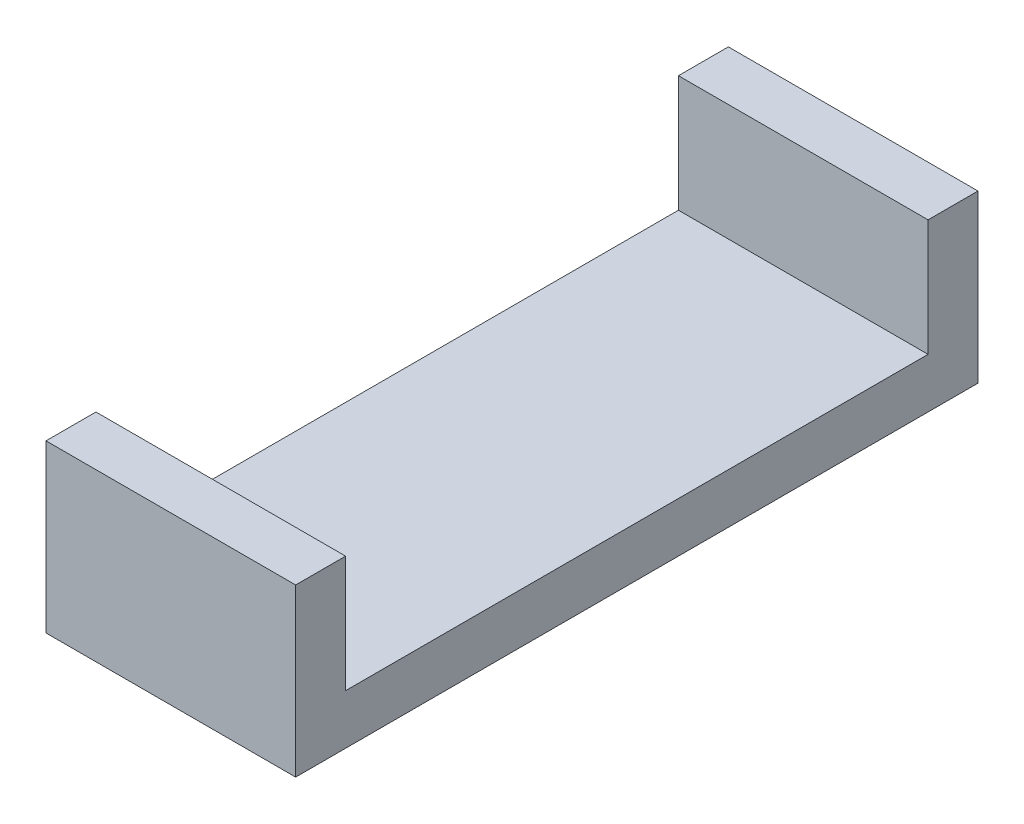
ISO-10303-21;
HEADER;
FILE_DESCRIPTION(('STEP AP214'),'2;1');
FILE_NAME('part.step','',(''),(''),'','','');
FILE_SCHEMA(('AUTOMOTIVE_DESIGN { 1 0 10303 214 1 1 1 1 }'));
ENDSEC;
DATA;
#1=APPLICATION_CONTEXT('core data for automotive mechanical design processes');
#2=APPLICATION_PROTOCOL_DEFINITION('international standard','automotive_design',2000,#1);
#3=PRODUCT_CONTEXT('',#1,'mechanical');
#4=PRODUCT('Part','Part','',(#3));
#5=PRODUCT_RELATED_PRODUCT_CATEGORY('part','',(#4));
#6=PRODUCT_DEFINITION_FORMATION('','',#4);
#7=PRODUCT_DEFINITION_CONTEXT('part definition',#1,'design');
#8=PRODUCT_DEFINITION('design','',#6,#7);
#9=PRODUCT_DEFINITION_SHAPE('','',#8);
#10=(LENGTH_UNIT() NAMED_UNIT(*) SI_UNIT(.MILLI.,.METRE.));
#11=(NAMED_UNIT(*) PLANE_ANGLE_UNIT() SI_UNIT($,.RADIAN.));
#12=(NAMED_UNIT(*) SI_UNIT($,.STERADIAN.) SOLID_ANGLE_UNIT());
#13=UNCERTAINTY_MEASURE_WITH_UNIT(LENGTH_MEASURE(1.E-05),#10,'distance_accuracy_value','');
#14=(GEOMETRIC_REPRESENTATION_CONTEXT(3) GLOBAL_UNCERTAINTY_ASSIGNED_CONTEXT((#13)) GLOBAL_UNIT_ASSIGNED_CONTEXT((#10,
#11,#12)) REPRESENTATION_CONTEXT('',''));
#15=CARTESIAN_POINT('',(0.,0.,0.));
#16=DIRECTION('',(0.,0.,1.));
#17=DIRECTION('',(1.,0.,0.));
#18=AXIS2_PLACEMENT_3D('',#15,#16,#17);
#19=CARTESIAN_POINT('',(0.,3.,0.));
#20=DIRECTION('',(0.,1.,0.));
#21=DIRECTION('',(0.,0.,1.));
#22=AXIS2_PLACEMENT_3D('',#19,#20,#21);
#23=PLANE('',#22);
#24=DIRECTION('',(0.,0.,-1.));
#25=VECTOR('',#24,1.);
#26=CARTESIAN_POINT('',(7.49999999999999,3.,-20.5));
#27=LINE('',#26,#25);
#28=CARTESIAN_POINT('',(7.5,3.,17.5));
#29=VERTEX_POINT('',#28);
#30=CARTESIAN_POINT('',(7.49999999999999,3.,-17.5));
#31=VERTEX_POINT('',#30);
#32=EDGE_CURVE('E53',#29,#31,#27,.T.);
#33=ORIENTED_EDGE('',*,*,#32,.T.);
#34=DIRECTION('',(1.,0.,0.));
#35=VECTOR('',#34,1.);
#36=CARTESIAN_POINT('',(7.5,3.,-17.5));
#37=LINE('',#36,#35);
#38=CARTESIAN_POINT('',(-7.5,3.,-17.5));
#39=VERTEX_POINT('',#38);
#40=EDGE_CURVE('E48',#39,#31,#37,.T.);
#41=ORIENTED_EDGE('',*,*,#40,.F.);
#42=DIRECTION('',(0.,0.,1.));
#43=VECTOR('',#42,1.);
#44=CARTESIAN_POINT('',(-7.5,3.,-20.5));
#45=LINE('',#44,#43);
#46=CARTESIAN_POINT('',(-7.5,3.,17.5));
#47=VERTEX_POINT('',#46);
#48=EDGE_CURVE('E119',#39,#47,#45,.T.);
#49=ORIENTED_EDGE('',*,*,#48,.T.);
#50=DIRECTION('',(-1.,0.,0.));
#51=VECTOR('',#50,1.);
#52=CARTESIAN_POINT('',(7.5,3.,17.5));
#53=LINE('',#52,#51);
#54=EDGE_CURVE('E120',#29,#47,#53,.T.);
#55=ORIENTED_EDGE('',*,*,#54,.F.);
#56=EDGE_LOOP('',(#33,#41,#49,#55));
#57=FACE_BOUND('',#56,.T.);
#58=ADVANCED_FACE('F33',(#57),#23,.T.);
#59=CARTESIAN_POINT('',(7.49999999999999,3.,-20.5));
#60=DIRECTION('',(-1.,0.,0.));
#61=DIRECTION('',(0.,0.,1.));
#62=AXIS2_PLACEMENT_3D('',#59,#60,#61);
#63=PLANE('',#62);
#64=DIRECTION('',(0.,0.,-1.));
#65=VECTOR('',#64,1.);
#66=CARTESIAN_POINT('',(7.49999999999999,0.,-20.5));
#67=LINE('',#66,#65);
#68=CARTESIAN_POINT('',(7.5,0.,20.5));
#69=VERTEX_POINT('',#68);
#70=CARTESIAN_POINT('',(7.49999999999999,0.,-20.5));
#71=VERTEX_POINT('',#70);
#72=EDGE_CURVE('E142',#69,#71,#67,.T.);
#73=ORIENTED_EDGE('',*,*,#72,.T.);
#74=DIRECTION('',(0.,-1.,0.));
#75=VECTOR('',#74,1.);
#76=CARTESIAN_POINT('',(7.49999999999999,3.,-20.5));
#77=LINE('',#76,#75);
#78=CARTESIAN_POINT('',(7.49999999999999,10.,-20.5));
#79=VERTEX_POINT('',#78);
#80=EDGE_CURVE('E11',#79,#71,#77,.T.);
#81=ORIENTED_EDGE('',*,*,#80,.F.);
#82=DIRECTION('',(0.,0.,-1.));
#83=VECTOR('',#82,1.);
#84=CARTESIAN_POINT('',(7.49999999999999,10.,-20.5));
#85=LINE('',#84,#83);
#86=CARTESIAN_POINT('',(7.5,10.,-17.5));
#87=VERTEX_POINT('',#86);
#88=EDGE_CURVE('E106',#87,#79,#85,.T.);
#89=ORIENTED_EDGE('',*,*,#88,.F.);
#90=DIRECTION('',(0.,-1.,0.));
#91=VECTOR('',#90,1.);
#92=CARTESIAN_POINT('',(7.5,10.,-17.5));
#93=LINE('',#92,#91);
#94=EDGE_CURVE('E102',#87,#31,#93,.T.);
#95=ORIENTED_EDGE('',*,*,#94,.T.);
#96=ORIENTED_EDGE('',*,*,#32,.F.);
#97=DIRECTION('',(0.,-1.,0.));
#98=VECTOR('',#97,1.);
#99=CARTESIAN_POINT('',(7.5,10.,17.5));
#100=LINE('',#99,#98);
#101=CARTESIAN_POINT('',(7.5,10.,17.5));
#102=VERTEX_POINT('',#101);
#103=EDGE_CURVE('E139',#102,#29,#100,.T.);
#104=ORIENTED_EDGE('',*,*,#103,.F.);
#105=DIRECTION('',(0.,0.,-1.));
#106=VECTOR('',#105,1.);
#107=CARTESIAN_POINT('',(7.5,10.,20.5));
#108=LINE('',#107,#106);
#109=CARTESIAN_POINT('',(7.5,10.,20.5));
#110=VERTEX_POINT('',#109);
#111=EDGE_CURVE('E130',#110,#102,#108,.T.);
#112=ORIENTED_EDGE('',*,*,#111,.F.);
#113=DIRECTION('',(0.,-1.,0.));
#114=VECTOR('',#113,1.);
#115=CARTESIAN_POINT('',(7.5,3.,20.5));
#116=LINE('',#115,#114);
#117=EDGE_CURVE('E146',#110,#69,#116,.T.);
#118=ORIENTED_EDGE('',*,*,#117,.T.);
#119=EDGE_LOOP('',(#73,#81,#89,#95,#96,#104,#112,#118));
#120=FACE_BOUND('',#119,.T.);
#121=ADVANCED_FACE('F35',(#120),#63,.F.);
#122=CARTESIAN_POINT('',(-7.5,3.,-20.5));
#123=DIRECTION('',(0.,0.,1.));
#124=DIRECTION('',(1.,0.,0.));
#125=AXIS2_PLACEMENT_3D('',#122,#123,#124);
#126=PLANE('',#125);
#127=DIRECTION('',(-1.,0.,0.));
#128=VECTOR('',#127,1.);
#129=CARTESIAN_POINT('',(-7.5,0.,-20.5));
#130=LINE('',#129,#128);
#131=CARTESIAN_POINT('',(-7.5,0.,-20.5));
#132=VERTEX_POINT('',#131);
#133=EDGE_CURVE('E149',#71,#132,#130,.T.);
#134=ORIENTED_EDGE('',*,*,#133,.T.);
#135=DIRECTION('',(0.,-1.,0.));
#136=VECTOR('',#135,1.);
#137=CARTESIAN_POINT('',(-7.5,3.,-20.5));
#138=LINE('',#137,#136);
#139=CARTESIAN_POINT('',(-7.5,10.,-20.5));
#140=VERTEX_POINT('',#139);
#141=EDGE_CURVE('E41',#140,#132,#138,.T.);
#142=ORIENTED_EDGE('',*,*,#141,.F.);
#143=DIRECTION('',(-1.,0.,0.));
#144=VECTOR('',#143,1.);
#145=CARTESIAN_POINT('',(-7.5,10.,-20.5));
#146=LINE('',#145,#144);
#147=EDGE_CURVE('E113',#79,#140,#146,.T.);
#148=ORIENTED_EDGE('',*,*,#147,.F.);
#149=ORIENTED_EDGE('',*,*,#80,.T.);
#150=EDGE_LOOP('',(#134,#142,#148,#149));
#151=FACE_BOUND('',#150,.T.);
#152=ADVANCED_FACE('F179',(#151),#126,.F.);
#153=CARTESIAN_POINT('',(-7.5,3.,-20.5));
#154=DIRECTION('',(1.,0.,0.));
#155=DIRECTION('',(0.,0.,-1.));
#156=AXIS2_PLACEMENT_3D('',#153,#154,#155);
#157=PLANE('',#156);
#158=DIRECTION('',(0.,0.,1.));
#159=VECTOR('',#158,1.);
#160=CARTESIAN_POINT('',(-7.5,0.,-20.5));
#161=LINE('',#160,#159);
#162=CARTESIAN_POINT('',(-7.49999999999999,0.,20.5));
#163=VERTEX_POINT('',#162);
#164=EDGE_CURVE('E151',#132,#163,#161,.T.);
#165=ORIENTED_EDGE('',*,*,#164,.T.);
#166=DIRECTION('',(0.,-1.,0.));
#167=VECTOR('',#166,1.);
#168=CARTESIAN_POINT('',(-7.49999999999999,3.,20.5));
#169=LINE('',#168,#167);
#170=CARTESIAN_POINT('',(-7.49999999999999,10.,20.5));
#171=VERTEX_POINT('',#170);
#172=EDGE_CURVE('E156',#171,#163,#169,.T.);
#173=ORIENTED_EDGE('',*,*,#172,.F.);
#174=DIRECTION('',(0.,0.,1.));
#175=VECTOR('',#174,1.);
#176=CARTESIAN_POINT('',(-7.5,10.,17.5));
#177=LINE('',#176,#175);
#178=CARTESIAN_POINT('',(-7.5,10.,17.5));
#179=VERTEX_POINT('',#178);
#180=EDGE_CURVE('E134',#179,#171,#177,.T.);
#181=ORIENTED_EDGE('',*,*,#180,.F.);
#182=DIRECTION('',(0.,-1.,0.));
#183=VECTOR('',#182,1.);
#184=CARTESIAN_POINT('',(-7.5,10.,17.5));
#185=LINE('',#184,#183);
#186=EDGE_CURVE('E136',#179,#47,#185,.T.);
#187=ORIENTED_EDGE('',*,*,#186,.T.);
#188=ORIENTED_EDGE('',*,*,#48,.F.);
#189=DIRECTION('',(0.,-1.,0.));
#190=VECTOR('',#189,1.);
#191=CARTESIAN_POINT('',(-7.5,10.,-17.5));
#192=LINE('',#191,#190);
#193=CARTESIAN_POINT('',(-7.5,10.,-17.5));
#194=VERTEX_POINT('',#193);
#195=EDGE_CURVE('E100',#194,#39,#192,.T.);
#196=ORIENTED_EDGE('',*,*,#195,.F.);
#197=DIRECTION('',(0.,0.,1.));
#198=VECTOR('',#197,1.);
#199=CARTESIAN_POINT('',(-7.5,10.,-17.5));
#200=LINE('',#199,#198);
#201=EDGE_CURVE('E107',#140,#194,#200,.T.);
#202=ORIENTED_EDGE('',*,*,#201,.F.);
#203=ORIENTED_EDGE('',*,*,#141,.T.);
#204=EDGE_LOOP('',(#165,#173,#181,#187,#188,#196,#202,#203));
#205=FACE_BOUND('',#204,.T.);
#206=ADVANCED_FACE('F117',(#205),#157,.F.);
#207=CARTESIAN_POINT('',(-7.49999999999999,3.,20.5));
#208=DIRECTION('',(0.,0.,-1.));
#209=DIRECTION('',(-1.,0.,0.));
#210=AXIS2_PLACEMENT_3D('',#207,#208,#209);
#211=PLANE('',#210);
#212=DIRECTION('',(1.,0.,0.));
#213=VECTOR('',#212,1.);
#214=CARTESIAN_POINT('',(-7.49999999999999,0.,20.5));
#215=LINE('',#214,#213);
#216=EDGE_CURVE('E144',#163,#69,#215,.T.);
#217=ORIENTED_EDGE('',*,*,#216,.T.);
#218=ORIENTED_EDGE('',*,*,#117,.F.);
#219=DIRECTION('',(1.,0.,0.));
#220=VECTOR('',#219,1.);
#221=CARTESIAN_POINT('',(-7.49999999999999,10.,20.5));
#222=LINE('',#221,#220);
#223=EDGE_CURVE('E123',#171,#110,#222,.T.);
#224=ORIENTED_EDGE('',*,*,#223,.F.);
#225=ORIENTED_EDGE('',*,*,#172,.T.);
#226=EDGE_LOOP('',(#217,#218,#224,#225));
#227=FACE_BOUND('',#226,.T.);
#228=ADVANCED_FACE('F165',(#227),#211,.F.);
#229=CARTESIAN_POINT('',(0.,0.,0.));
#230=DIRECTION('',(0.,1.,0.));
#231=DIRECTION('',(0.,0.,1.));
#232=AXIS2_PLACEMENT_3D('',#229,#230,#231);
#233=PLANE('',#232);
#234=ORIENTED_EDGE('',*,*,#72,.F.);
#235=ORIENTED_EDGE('',*,*,#216,.F.);
#236=ORIENTED_EDGE('',*,*,#164,.F.);
#237=ORIENTED_EDGE('',*,*,#133,.F.);
#238=EDGE_LOOP('',(#234,#235,#236,#237));
#239=FACE_BOUND('',#238,.T.);
#240=ADVANCED_FACE('F163',(#239),#233,.F.);
#241=CARTESIAN_POINT('',(7.5,10.,17.5));
#242=DIRECTION('',(0.,0.,1.));
#243=DIRECTION('',(1.,0.,0.));
#244=AXIS2_PLACEMENT_3D('',#241,#242,#243);
#245=PLANE('',#244);
#246=ORIENTED_EDGE('',*,*,#54,.T.);
#247=ORIENTED_EDGE('',*,*,#186,.F.);
#248=DIRECTION('',(-1.,0.,0.));
#249=VECTOR('',#248,1.);
#250=CARTESIAN_POINT('',(7.5,10.,17.5));
#251=LINE('',#250,#249);
#252=EDGE_CURVE('E132',#102,#179,#251,.T.);
#253=ORIENTED_EDGE('',*,*,#252,.F.);
#254=ORIENTED_EDGE('',*,*,#103,.T.);
#255=EDGE_LOOP('',(#246,#247,#253,#254));
#256=FACE_BOUND('',#255,.T.);
#257=ADVANCED_FACE('F176',(#256),#245,.F.);
#258=CARTESIAN_POINT('',(0.,10.,0.));
#259=DIRECTION('',(0.,1.,0.));
#260=DIRECTION('',(0.,0.,1.));
#261=AXIS2_PLACEMENT_3D('',#258,#259,#260);
#262=PLANE('',#261);
#263=ORIENTED_EDGE('',*,*,#223,.T.);
#264=ORIENTED_EDGE('',*,*,#111,.T.);
#265=ORIENTED_EDGE('',*,*,#252,.T.);
#266=ORIENTED_EDGE('',*,*,#180,.T.);
#267=EDGE_LOOP('',(#263,#264,#265,#266));
#268=FACE_BOUND('',#267,.T.);
#269=ADVANCED_FACE('F172',(#268),#262,.T.);
#270=CARTESIAN_POINT('',(7.5,10.,-17.5));
#271=DIRECTION('',(0.,0.,-1.));
#272=DIRECTION('',(-1.,0.,0.));
#273=AXIS2_PLACEMENT_3D('',#270,#271,#272);
#274=PLANE('',#273);
#275=ORIENTED_EDGE('',*,*,#40,.T.);
#276=ORIENTED_EDGE('',*,*,#94,.F.);
#277=DIRECTION('',(1.,0.,0.));
#278=VECTOR('',#277,1.);
#279=CARTESIAN_POINT('',(7.5,10.,-17.5));
#280=LINE('',#279,#278);
#281=EDGE_CURVE('E96',#194,#87,#280,.T.);
#282=ORIENTED_EDGE('',*,*,#281,.F.);
#283=ORIENTED_EDGE('',*,*,#195,.T.);
#284=EDGE_LOOP('',(#275,#276,#282,#283));
#285=FACE_BOUND('',#284,.T.);
#286=ADVANCED_FACE('F98',(#285),#274,.F.);
#287=CARTESIAN_POINT('',(0.,10.,0.));
#288=DIRECTION('',(0.,-1.,0.));
#289=DIRECTION('',(0.,0.,-1.));
#290=AXIS2_PLACEMENT_3D('',#287,#288,#289);
#291=PLANE('',#290);
#292=ORIENTED_EDGE('',*,*,#201,.T.);
#293=ORIENTED_EDGE('',*,*,#281,.T.);
#294=ORIENTED_EDGE('',*,*,#88,.T.);
#295=ORIENTED_EDGE('',*,*,#147,.T.);
#296=EDGE_LOOP('',(#292,#293,#294,#295));
#297=FACE_BOUND('',#296,.T.);
#298=ADVANCED_FACE('F111',(#297),#291,.F.);
#299=CLOSED_SHELL('',(#58,#121,#152,#206,#228,#240,#257,#269,#286,#298));
#300=MANIFOLD_SOLID_BREP('B2',#299);
#301=ADVANCED_BREP_SHAPE_REPRESENTATION('',(#18,#300),#14);
#302=SHAPE_DEFINITION_REPRESENTATION(#9,#301);
ENDSEC;
END-ISO-10303-21;
